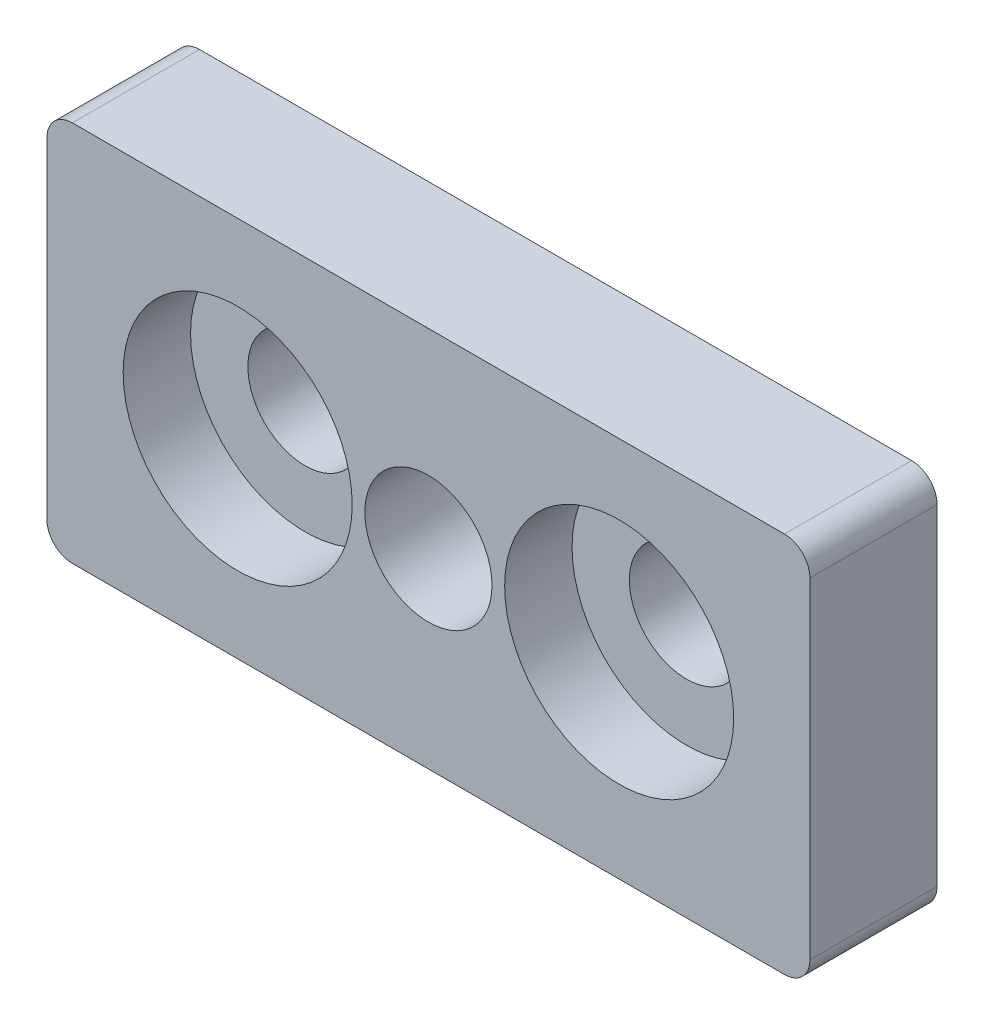
ISO-10303-21;
HEADER;
FILE_DESCRIPTION(('STEP AP214'),'2;1');
FILE_NAME('part.step','',(''),(''),'','','');
FILE_SCHEMA(('AUTOMOTIVE_DESIGN { 1 0 10303 214 1 1 1 1 }'));
ENDSEC;
DATA;
#1=APPLICATION_CONTEXT('core data for automotive mechanical design processes');
#2=APPLICATION_PROTOCOL_DEFINITION('international standard','automotive_design',2000,#1);
#3=PRODUCT_CONTEXT('',#1,'mechanical');
#4=PRODUCT('Part','Part','',(#3));
#5=PRODUCT_RELATED_PRODUCT_CATEGORY('part','',(#4));
#6=PRODUCT_DEFINITION_FORMATION('','',#4);
#7=PRODUCT_DEFINITION_CONTEXT('part definition',#1,'design');
#8=PRODUCT_DEFINITION('design','',#6,#7);
#9=PRODUCT_DEFINITION_SHAPE('','',#8);
#10=(LENGTH_UNIT() NAMED_UNIT(*) SI_UNIT(.MILLI.,.METRE.));
#11=(NAMED_UNIT(*) PLANE_ANGLE_UNIT() SI_UNIT($,.RADIAN.));
#12=(NAMED_UNIT(*) SI_UNIT($,.STERADIAN.) SOLID_ANGLE_UNIT());
#13=UNCERTAINTY_MEASURE_WITH_UNIT(LENGTH_MEASURE(1.E-05),#10,'distance_accuracy_value','');
#14=(GEOMETRIC_REPRESENTATION_CONTEXT(3) GLOBAL_UNCERTAINTY_ASSIGNED_CONTEXT((#13)) GLOBAL_UNIT_ASSIGNED_CONTEXT((#10,
#11,#12)) REPRESENTATION_CONTEXT('',''));
#15=CARTESIAN_POINT('',(0.,0.,0.));
#16=DIRECTION('',(0.,0.,1.));
#17=DIRECTION('',(1.,0.,0.));
#18=AXIS2_PLACEMENT_3D('',#15,#16,#17);
#19=CARTESIAN_POINT('',(30.,-15.,0.));
#20=DIRECTION('',(1.,0.,0.));
#21=DIRECTION('',(0.,1.,0.));
#22=AXIS2_PLACEMENT_3D('',#19,#20,#21);
#23=PLANE('',#22);
#24=DIRECTION('',(0.,1.,0.));
#25=VECTOR('',#24,1.);
#26=CARTESIAN_POINT('',(30.,-15.,10.));
#27=LINE('',#26,#25);
#28=CARTESIAN_POINT('',(30.,-13.,10.));
#29=VERTEX_POINT('',#28);
#30=CARTESIAN_POINT('',(30.,13.,10.));
#31=VERTEX_POINT('',#30);
#32=EDGE_CURVE('E152',#29,#31,#27,.T.);
#33=ORIENTED_EDGE('',*,*,#32,.F.);
#34=DIRECTION('',(0.,0.,1.));
#35=VECTOR('',#34,1.);
#36=CARTESIAN_POINT('',(30.,-13.,0.));
#37=LINE('',#36,#35);
#38=CARTESIAN_POINT('',(30.,-13.,0.));
#39=VERTEX_POINT('',#38);
#40=EDGE_CURVE('E11',#29,#39,#37,.F.);
#41=ORIENTED_EDGE('',*,*,#40,.T.);
#42=DIRECTION('',(0.,1.,0.));
#43=VECTOR('',#42,1.);
#44=CARTESIAN_POINT('',(30.,-15.,0.));
#45=LINE('',#44,#43);
#46=CARTESIAN_POINT('',(30.,13.,0.));
#47=VERTEX_POINT('',#46);
#48=EDGE_CURVE('E155',#39,#47,#45,.T.);
#49=ORIENTED_EDGE('',*,*,#48,.T.);
#50=DIRECTION('',(0.,0.,1.));
#51=VECTOR('',#50,1.);
#52=CARTESIAN_POINT('',(30.,13.,0.));
#53=LINE('',#52,#51);
#54=EDGE_CURVE('E40',#47,#31,#53,.T.);
#55=ORIENTED_EDGE('',*,*,#54,.T.);
#56=EDGE_LOOP('',(#33,#41,#49,#55));
#57=FACE_BOUND('',#56,.T.);
#58=ADVANCED_FACE('F32',(#57),#23,.T.);
#59=CARTESIAN_POINT('',(-30.,-15.,0.));
#60=DIRECTION('',(0.,-1.,0.));
#61=DIRECTION('',(1.,0.,0.));
#62=AXIS2_PLACEMENT_3D('',#59,#60,#61);
#63=PLANE('',#62);
#64=DIRECTION('',(1.,0.,0.));
#65=VECTOR('',#64,1.);
#66=CARTESIAN_POINT('',(-30.,-15.,10.));
#67=LINE('',#66,#65);
#68=CARTESIAN_POINT('',(-28.,-15.,10.));
#69=VERTEX_POINT('',#68);
#70=CARTESIAN_POINT('',(28.,-15.,10.));
#71=VERTEX_POINT('',#70);
#72=EDGE_CURVE('E117',#69,#71,#67,.T.);
#73=ORIENTED_EDGE('',*,*,#72,.F.);
#74=DIRECTION('',(0.,0.,1.));
#75=VECTOR('',#74,1.);
#76=CARTESIAN_POINT('',(-28.,-15.,0.));
#77=LINE('',#76,#75);
#78=CARTESIAN_POINT('',(-28.,-15.,0.));
#79=VERTEX_POINT('',#78);
#80=EDGE_CURVE('E135',#69,#79,#77,.F.);
#81=ORIENTED_EDGE('',*,*,#80,.T.);
#82=DIRECTION('',(1.,0.,0.));
#83=VECTOR('',#82,1.);
#84=CARTESIAN_POINT('',(-30.,-15.,0.));
#85=LINE('',#84,#83);
#86=CARTESIAN_POINT('',(28.,-15.,0.));
#87=VERTEX_POINT('',#86);
#88=EDGE_CURVE('E120',#79,#87,#85,.T.);
#89=ORIENTED_EDGE('',*,*,#88,.T.);
#90=DIRECTION('',(0.,0.,1.));
#91=VECTOR('',#90,1.);
#92=CARTESIAN_POINT('',(28.,-15.,0.));
#93=LINE('',#92,#91);
#94=EDGE_CURVE('E132',#87,#71,#93,.T.);
#95=ORIENTED_EDGE('',*,*,#94,.T.);
#96=EDGE_LOOP('',(#73,#81,#89,#95));
#97=FACE_BOUND('',#96,.T.);
#98=ADVANCED_FACE('F221',(#97),#63,.T.);
#99=CARTESIAN_POINT('',(-30.,15.,0.));
#100=DIRECTION('',(-1.,0.,0.));
#101=DIRECTION('',(0.,-1.,0.));
#102=AXIS2_PLACEMENT_3D('',#99,#100,#101);
#103=PLANE('',#102);
#104=DIRECTION('',(0.,-1.,0.));
#105=VECTOR('',#104,1.);
#106=CARTESIAN_POINT('',(-30.,15.,0.));
#107=LINE('',#106,#105);
#108=CARTESIAN_POINT('',(-30.,13.,0.));
#109=VERTEX_POINT('',#108);
#110=CARTESIAN_POINT('',(-30.,-13.,0.));
#111=VERTEX_POINT('',#110);
#112=EDGE_CURVE('E125',#109,#111,#107,.T.);
#113=ORIENTED_EDGE('',*,*,#112,.T.);
#114=DIRECTION('',(0.,0.,1.));
#115=VECTOR('',#114,1.);
#116=CARTESIAN_POINT('',(-30.,-13.,0.));
#117=LINE('',#116,#115);
#118=CARTESIAN_POINT('',(-30.,-13.,10.));
#119=VERTEX_POINT('',#118);
#120=EDGE_CURVE('E116',#111,#119,#117,.T.);
#121=ORIENTED_EDGE('',*,*,#120,.T.);
#122=DIRECTION('',(0.,-1.,0.));
#123=VECTOR('',#122,1.);
#124=CARTESIAN_POINT('',(-30.,15.,10.));
#125=LINE('',#124,#123);
#126=CARTESIAN_POINT('',(-30.,13.,10.));
#127=VERTEX_POINT('',#126);
#128=EDGE_CURVE('E101',#127,#119,#125,.T.);
#129=ORIENTED_EDGE('',*,*,#128,.F.);
#130=DIRECTION('',(0.,0.,1.));
#131=VECTOR('',#130,1.);
#132=CARTESIAN_POINT('',(-30.,13.,0.));
#133=LINE('',#132,#131);
#134=EDGE_CURVE('E114',#127,#109,#133,.F.);
#135=ORIENTED_EDGE('',*,*,#134,.T.);
#136=EDGE_LOOP('',(#113,#121,#129,#135));
#137=FACE_BOUND('',#136,.T.);
#138=ADVANCED_FACE('F113',(#137),#103,.T.);
#139=CARTESIAN_POINT('',(30.,15.,0.));
#140=DIRECTION('',(0.,1.,0.));
#141=DIRECTION('',(-1.,0.,0.));
#142=AXIS2_PLACEMENT_3D('',#139,#140,#141);
#143=PLANE('',#142);
#144=DIRECTION('',(-1.,0.,0.));
#145=VECTOR('',#144,1.);
#146=CARTESIAN_POINT('',(30.,15.,0.));
#147=LINE('',#146,#145);
#148=CARTESIAN_POINT('',(28.,15.,0.));
#149=VERTEX_POINT('',#148);
#150=CARTESIAN_POINT('',(-28.,15.,0.));
#151=VERTEX_POINT('',#150);
#152=EDGE_CURVE('E167',#149,#151,#147,.T.);
#153=ORIENTED_EDGE('',*,*,#152,.T.);
#154=DIRECTION('',(0.,0.,1.));
#155=VECTOR('',#154,1.);
#156=CARTESIAN_POINT('',(-28.,15.,0.));
#157=LINE('',#156,#155);
#158=CARTESIAN_POINT('',(-28.,15.,10.));
#159=VERTEX_POINT('',#158);
#160=EDGE_CURVE('E145',#151,#159,#157,.T.);
#161=ORIENTED_EDGE('',*,*,#160,.T.);
#162=DIRECTION('',(-1.,0.,0.));
#163=VECTOR('',#162,1.);
#164=CARTESIAN_POINT('',(30.,15.,10.));
#165=LINE('',#164,#163);
#166=CARTESIAN_POINT('',(28.,15.,10.));
#167=VERTEX_POINT('',#166);
#168=EDGE_CURVE('E102',#167,#159,#165,.T.);
#169=ORIENTED_EDGE('',*,*,#168,.F.);
#170=DIRECTION('',(0.,0.,1.));
#171=VECTOR('',#170,1.);
#172=CARTESIAN_POINT('',(28.,15.,0.));
#173=LINE('',#172,#171);
#174=EDGE_CURVE('E54',#167,#149,#173,.F.);
#175=ORIENTED_EDGE('',*,*,#174,.T.);
#176=EDGE_LOOP('',(#153,#161,#169,#175));
#177=FACE_BOUND('',#176,.T.);
#178=ADVANCED_FACE('F230',(#177),#143,.T.);
#179=CARTESIAN_POINT('',(0.,0.,0.));
#180=DIRECTION('',(0.,0.,1.));
#181=DIRECTION('',(1.,0.,0.));
#182=AXIS2_PLACEMENT_3D('',#179,#180,#181);
#183=PLANE('',#182);
#184=CARTESIAN_POINT('',(-15.,0.,0.));
#185=DIRECTION('',(0.,0.,1.));
#186=DIRECTION('',(1.,0.,0.));
#187=AXIS2_PLACEMENT_3D('',#184,#185,#186);
#188=CIRCLE('',#187,4.50000000000001);
#189=CARTESIAN_POINT('',(-10.5,0.,0.));
#190=VERTEX_POINT('',#189);
#191=EDGE_CURVE('E184',#190,#190,#188,.T.);
#192=ORIENTED_EDGE('',*,*,#191,.T.);
#193=EDGE_LOOP('',(#192));
#194=FACE_BOUND('',#193,.T.);
#195=CARTESIAN_POINT('',(15.,0.4628070712156,0.));
#196=DIRECTION('',(0.,0.,1.));
#197=DIRECTION('',(1.,0.,0.));
#198=AXIS2_PLACEMENT_3D('',#195,#196,#197);
#199=CIRCLE('',#198,4.50000000000001);
#200=CARTESIAN_POINT('',(19.5,0.4628070712156,0.));
#201=VERTEX_POINT('',#200);
#202=EDGE_CURVE('E172',#201,#201,#199,.T.);
#203=ORIENTED_EDGE('',*,*,#202,.T.);
#204=EDGE_LOOP('',(#203));
#205=FACE_BOUND('',#204,.T.);
#206=CARTESIAN_POINT('',(0.,0.,0.));
#207=DIRECTION('',(0.,0.,1.));
#208=DIRECTION('',(1.,0.,0.));
#209=AXIS2_PLACEMENT_3D('',#206,#207,#208);
#210=CIRCLE('',#209,4.99999999999999);
#211=CARTESIAN_POINT('',(4.99999999999999,0.,0.));
#212=VERTEX_POINT('',#211);
#213=EDGE_CURVE('E159',#212,#212,#210,.T.);
#214=ORIENTED_EDGE('',*,*,#213,.T.);
#215=EDGE_LOOP('',(#214));
#216=FACE_BOUND('',#215,.T.);
#217=ORIENTED_EDGE('',*,*,#88,.F.);
#218=CARTESIAN_POINT('',(-28.,-13.,0.));
#219=DIRECTION('',(0.,0.,1.));
#220=DIRECTION('',(1.,0.,0.));
#221=AXIS2_PLACEMENT_3D('',#218,#219,#220);
#222=CIRCLE('',#221,2.);
#223=EDGE_CURVE('E142',#79,#111,#222,.F.);
#224=ORIENTED_EDGE('',*,*,#223,.T.);
#225=ORIENTED_EDGE('',*,*,#112,.F.);
#226=CARTESIAN_POINT('',(-28.,13.,0.));
#227=DIRECTION('',(0.,0.,1.));
#228=DIRECTION('',(1.,0.,0.));
#229=AXIS2_PLACEMENT_3D('',#226,#227,#228);
#230=CIRCLE('',#229,2.);
#231=EDGE_CURVE('E47',#109,#151,#230,.F.);
#232=ORIENTED_EDGE('',*,*,#231,.T.);
#233=ORIENTED_EDGE('',*,*,#152,.F.);
#234=CARTESIAN_POINT('',(28.,13.,0.));
#235=DIRECTION('',(0.,0.,1.));
#236=DIRECTION('',(1.,0.,0.));
#237=AXIS2_PLACEMENT_3D('',#234,#235,#236);
#238=CIRCLE('',#237,2.);
#239=EDGE_CURVE('E137',#149,#47,#238,.F.);
#240=ORIENTED_EDGE('',*,*,#239,.T.);
#241=ORIENTED_EDGE('',*,*,#48,.F.);
#242=CARTESIAN_POINT('',(28.,-13.,0.));
#243=DIRECTION('',(0.,0.,1.));
#244=DIRECTION('',(1.,0.,0.));
#245=AXIS2_PLACEMENT_3D('',#242,#243,#244);
#246=CIRCLE('',#245,2.);
#247=EDGE_CURVE('E139',#39,#87,#246,.F.);
#248=ORIENTED_EDGE('',*,*,#247,.T.);
#249=EDGE_LOOP('',(#217,#224,#225,#232,#233,#240,#241,#248));
#250=FACE_BOUND('',#249,.T.);
#251=ADVANCED_FACE('F202',(#194,#205,#216,#250),#183,.F.);
#252=CARTESIAN_POINT('',(0.,0.,10.));
#253=DIRECTION('',(0.,0.,1.));
#254=DIRECTION('',(1.,0.,0.));
#255=AXIS2_PLACEMENT_3D('',#252,#253,#254);
#256=PLANE('',#255);
#257=CARTESIAN_POINT('',(-15.,0.,10.));
#258=DIRECTION('',(0.,0.,1.));
#259=DIRECTION('',(1.,0.,0.));
#260=AXIS2_PLACEMENT_3D('',#257,#258,#259);
#261=CIRCLE('',#260,9.0055);
#262=CARTESIAN_POINT('',(-5.9945,0.,10.));
#263=VERTEX_POINT('',#262);
#264=EDGE_CURVE('E193',#263,#263,#261,.T.);
#265=ORIENTED_EDGE('',*,*,#264,.F.);
#266=EDGE_LOOP('',(#265));
#267=FACE_BOUND('',#266,.T.);
#268=CARTESIAN_POINT('',(15.,0.4628070712156,10.));
#269=DIRECTION('',(0.,0.,1.));
#270=DIRECTION('',(1.,0.,0.));
#271=AXIS2_PLACEMENT_3D('',#268,#269,#270);
#272=CIRCLE('',#271,9.0055);
#273=CARTESIAN_POINT('',(24.0055,0.4628070712156,10.));
#274=VERTEX_POINT('',#273);
#275=EDGE_CURVE('E181',#274,#274,#272,.T.);
#276=ORIENTED_EDGE('',*,*,#275,.F.);
#277=EDGE_LOOP('',(#276));
#278=FACE_BOUND('',#277,.T.);
#279=CARTESIAN_POINT('',(0.,0.,10.));
#280=DIRECTION('',(0.,0.,1.));
#281=DIRECTION('',(1.,0.,0.));
#282=AXIS2_PLACEMENT_3D('',#279,#280,#281);
#283=CIRCLE('',#282,4.99999999999999);
#284=CARTESIAN_POINT('',(4.99999999999999,0.,10.));
#285=VERTEX_POINT('',#284);
#286=EDGE_CURVE('E163',#285,#285,#283,.T.);
#287=ORIENTED_EDGE('',*,*,#286,.F.);
#288=EDGE_LOOP('',(#287));
#289=FACE_BOUND('',#288,.T.);
#290=ORIENTED_EDGE('',*,*,#128,.T.);
#291=CARTESIAN_POINT('',(-28.,-13.,10.));
#292=DIRECTION('',(0.,0.,1.));
#293=DIRECTION('',(1.,0.,0.));
#294=AXIS2_PLACEMENT_3D('',#291,#292,#293);
#295=CIRCLE('',#294,2.);
#296=EDGE_CURVE('E107',#119,#69,#295,.T.);
#297=ORIENTED_EDGE('',*,*,#296,.T.);
#298=ORIENTED_EDGE('',*,*,#72,.T.);
#299=CARTESIAN_POINT('',(28.,-13.,10.));
#300=DIRECTION('',(0.,0.,1.));
#301=DIRECTION('',(1.,0.,0.));
#302=AXIS2_PLACEMENT_3D('',#299,#300,#301);
#303=CIRCLE('',#302,2.);
#304=EDGE_CURVE('E108',#71,#29,#303,.T.);
#305=ORIENTED_EDGE('',*,*,#304,.T.);
#306=ORIENTED_EDGE('',*,*,#32,.T.);
#307=CARTESIAN_POINT('',(28.,13.,10.));
#308=DIRECTION('',(0.,0.,1.));
#309=DIRECTION('',(1.,0.,0.));
#310=AXIS2_PLACEMENT_3D('',#307,#308,#309);
#311=CIRCLE('',#310,2.);
#312=EDGE_CURVE('E122',#31,#167,#311,.T.);
#313=ORIENTED_EDGE('',*,*,#312,.T.);
#314=ORIENTED_EDGE('',*,*,#168,.T.);
#315=CARTESIAN_POINT('',(-28.,13.,10.));
#316=DIRECTION('',(0.,0.,1.));
#317=DIRECTION('',(1.,0.,0.));
#318=AXIS2_PLACEMENT_3D('',#315,#316,#317);
#319=CIRCLE('',#318,2.);
#320=EDGE_CURVE('E98',#159,#127,#319,.T.);
#321=ORIENTED_EDGE('',*,*,#320,.T.);
#322=EDGE_LOOP('',(#290,#297,#298,#305,#306,#313,#314,#321));
#323=FACE_BOUND('',#322,.T.);
#324=ADVANCED_FACE('F100',(#267,#278,#289,#323),#256,.T.);
#325=CARTESIAN_POINT('',(0.,0.,10.));
#326=DIRECTION('',(0.,0.,1.));
#327=DIRECTION('',(1.,0.,0.));
#328=AXIS2_PLACEMENT_3D('',#325,#326,#327);
#329=CYLINDRICAL_SURFACE('',#328,4.99999999999999);
#330=ORIENTED_EDGE('',*,*,#213,.F.);
#331=EDGE_LOOP('',(#330));
#332=FACE_BOUND('',#331,.T.);
#333=ORIENTED_EDGE('',*,*,#286,.T.);
#334=EDGE_LOOP('',(#333));
#335=FACE_BOUND('',#334,.T.);
#336=ADVANCED_FACE('F201',(#332,#335),#329,.F.);
#337=CARTESIAN_POINT('',(15.,0.4628070712156,10.));
#338=DIRECTION('',(0.,0.,1.));
#339=DIRECTION('',(1.,0.,0.));
#340=AXIS2_PLACEMENT_3D('',#337,#338,#339);
#341=CYLINDRICAL_SURFACE('',#340,4.50000000000001);
#342=ORIENTED_EDGE('',*,*,#202,.F.);
#343=EDGE_LOOP('',(#342));
#344=FACE_BOUND('',#343,.T.);
#345=CARTESIAN_POINT('',(15.,0.4628070712156,4.7));
#346=DIRECTION('',(0.,0.,1.));
#347=DIRECTION('',(1.,0.,0.));
#348=AXIS2_PLACEMENT_3D('',#345,#346,#347);
#349=CIRCLE('',#348,4.50000000000001);
#350=CARTESIAN_POINT('',(19.5,0.4628070712156,4.7));
#351=VERTEX_POINT('',#350);
#352=EDGE_CURVE('E175',#351,#351,#349,.T.);
#353=ORIENTED_EDGE('',*,*,#352,.T.);
#354=EDGE_LOOP('',(#353));
#355=FACE_BOUND('',#354,.T.);
#356=ADVANCED_FACE('F209',(#344,#355),#341,.F.);
#357=CARTESIAN_POINT('',(19.5,0.4628070712156,4.7));
#358=DIRECTION('',(0.,0.,-1.));
#359=DIRECTION('',(-1.,0.,0.));
#360=AXIS2_PLACEMENT_3D('',#357,#358,#359);
#361=PLANE('',#360);
#362=ORIENTED_EDGE('',*,*,#352,.F.);
#363=EDGE_LOOP('',(#362));
#364=FACE_BOUND('',#363,.T.);
#365=CARTESIAN_POINT('',(15.,0.4628070712156,4.7));
#366=DIRECTION('',(0.,0.,1.));
#367=DIRECTION('',(1.,0.,0.));
#368=AXIS2_PLACEMENT_3D('',#365,#366,#367);
#369=CIRCLE('',#368,9.0055);
#370=CARTESIAN_POINT('',(24.0055,0.4628070712156,4.7));
#371=VERTEX_POINT('',#370);
#372=EDGE_CURVE('E178',#371,#371,#369,.T.);
#373=ORIENTED_EDGE('',*,*,#372,.T.);
#374=EDGE_LOOP('',(#373));
#375=FACE_BOUND('',#374,.T.);
#376=ADVANCED_FACE('F215',(#364,#375),#361,.F.);
#377=CARTESIAN_POINT('',(15.,0.4628070712156,10.));
#378=DIRECTION('',(0.,0.,1.));
#379=DIRECTION('',(1.,0.,0.));
#380=AXIS2_PLACEMENT_3D('',#377,#378,#379);
#381=CYLINDRICAL_SURFACE('',#380,9.0055);
#382=ORIENTED_EDGE('',*,*,#372,.F.);
#383=EDGE_LOOP('',(#382));
#384=FACE_BOUND('',#383,.T.);
#385=ORIENTED_EDGE('',*,*,#275,.T.);
#386=EDGE_LOOP('',(#385));
#387=FACE_BOUND('',#386,.T.);
#388=ADVANCED_FACE('F295',(#384,#387),#381,.F.);
#389=CARTESIAN_POINT('',(-15.,0.,10.));
#390=DIRECTION('',(0.,0.,1.));
#391=DIRECTION('',(1.,0.,0.));
#392=AXIS2_PLACEMENT_3D('',#389,#390,#391);
#393=CYLINDRICAL_SURFACE('',#392,4.50000000000001);
#394=ORIENTED_EDGE('',*,*,#191,.F.);
#395=EDGE_LOOP('',(#394));
#396=FACE_BOUND('',#395,.T.);
#397=CARTESIAN_POINT('',(-15.,0.,4.7));
#398=DIRECTION('',(0.,0.,1.));
#399=DIRECTION('',(1.,0.,0.));
#400=AXIS2_PLACEMENT_3D('',#397,#398,#399);
#401=CIRCLE('',#400,4.50000000000001);
#402=CARTESIAN_POINT('',(-10.5,0.,4.7));
#403=VERTEX_POINT('',#402);
#404=EDGE_CURVE('E187',#403,#403,#401,.T.);
#405=ORIENTED_EDGE('',*,*,#404,.T.);
#406=EDGE_LOOP('',(#405));
#407=FACE_BOUND('',#406,.T.);
#408=ADVANCED_FACE('F285',(#396,#407),#393,.F.);
#409=CARTESIAN_POINT('',(-10.5,0.,4.7));
#410=DIRECTION('',(0.,0.,-1.));
#411=DIRECTION('',(-1.,0.,0.));
#412=AXIS2_PLACEMENT_3D('',#409,#410,#411);
#413=PLANE('',#412);
#414=ORIENTED_EDGE('',*,*,#404,.F.);
#415=EDGE_LOOP('',(#414));
#416=FACE_BOUND('',#415,.T.);
#417=CARTESIAN_POINT('',(-15.,0.,4.7));
#418=DIRECTION('',(0.,0.,1.));
#419=DIRECTION('',(1.,0.,0.));
#420=AXIS2_PLACEMENT_3D('',#417,#418,#419);
#421=CIRCLE('',#420,9.0055);
#422=CARTESIAN_POINT('',(-5.9945,0.,4.7));
#423=VERTEX_POINT('',#422);
#424=EDGE_CURVE('E190',#423,#423,#421,.T.);
#425=ORIENTED_EDGE('',*,*,#424,.T.);
#426=EDGE_LOOP('',(#425));
#427=FACE_BOUND('',#426,.T.);
#428=ADVANCED_FACE('F274',(#416,#427),#413,.F.);
#429=CARTESIAN_POINT('',(-15.,0.,10.));
#430=DIRECTION('',(0.,0.,1.));
#431=DIRECTION('',(1.,0.,0.));
#432=AXIS2_PLACEMENT_3D('',#429,#430,#431);
#433=CYLINDRICAL_SURFACE('',#432,9.0055);
#434=ORIENTED_EDGE('',*,*,#424,.F.);
#435=EDGE_LOOP('',(#434));
#436=FACE_BOUND('',#435,.T.);
#437=ORIENTED_EDGE('',*,*,#264,.T.);
#438=EDGE_LOOP('',(#437));
#439=FACE_BOUND('',#438,.T.);
#440=ADVANCED_FACE('F197',(#436,#439),#433,.F.);
#441=CARTESIAN_POINT('',(-28.,-13.,0.));
#442=DIRECTION('',(0.,0.,1.));
#443=DIRECTION('',(1.,0.,0.));
#444=AXIS2_PLACEMENT_3D('',#441,#442,#443);
#445=CYLINDRICAL_SURFACE('',#444,2.);
#446=ORIENTED_EDGE('',*,*,#223,.F.);
#447=ORIENTED_EDGE('',*,*,#80,.F.);
#448=ORIENTED_EDGE('',*,*,#296,.F.);
#449=ORIENTED_EDGE('',*,*,#120,.F.);
#450=EDGE_LOOP('',(#446,#447,#448,#449));
#451=FACE_BOUND('',#450,.T.);
#452=ADVANCED_FACE('F232',(#451),#445,.T.);
#453=CARTESIAN_POINT('',(-28.,13.,0.));
#454=DIRECTION('',(0.,0.,1.));
#455=DIRECTION('',(1.,0.,0.));
#456=AXIS2_PLACEMENT_3D('',#453,#454,#455);
#457=CYLINDRICAL_SURFACE('',#456,2.);
#458=ORIENTED_EDGE('',*,*,#231,.F.);
#459=ORIENTED_EDGE('',*,*,#134,.F.);
#460=ORIENTED_EDGE('',*,*,#320,.F.);
#461=ORIENTED_EDGE('',*,*,#160,.F.);
#462=EDGE_LOOP('',(#458,#459,#460,#461));
#463=FACE_BOUND('',#462,.T.);
#464=ADVANCED_FACE('F119',(#463),#457,.T.);
#465=CARTESIAN_POINT('',(28.,-13.,0.));
#466=DIRECTION('',(0.,0.,1.));
#467=DIRECTION('',(1.,0.,0.));
#468=AXIS2_PLACEMENT_3D('',#465,#466,#467);
#469=CYLINDRICAL_SURFACE('',#468,2.);
#470=ORIENTED_EDGE('',*,*,#247,.F.);
#471=ORIENTED_EDGE('',*,*,#40,.F.);
#472=ORIENTED_EDGE('',*,*,#304,.F.);
#473=ORIENTED_EDGE('',*,*,#94,.F.);
#474=EDGE_LOOP('',(#470,#471,#472,#473));
#475=FACE_BOUND('',#474,.T.);
#476=ADVANCED_FACE('F237',(#475),#469,.T.);
#477=CARTESIAN_POINT('',(28.,13.,0.));
#478=DIRECTION('',(0.,0.,1.));
#479=DIRECTION('',(1.,0.,0.));
#480=AXIS2_PLACEMENT_3D('',#477,#478,#479);
#481=CYLINDRICAL_SURFACE('',#480,2.);
#482=ORIENTED_EDGE('',*,*,#239,.F.);
#483=ORIENTED_EDGE('',*,*,#174,.F.);
#484=ORIENTED_EDGE('',*,*,#312,.F.);
#485=ORIENTED_EDGE('',*,*,#54,.F.);
#486=EDGE_LOOP('',(#482,#483,#484,#485));
#487=FACE_BOUND('',#486,.T.);
#488=ADVANCED_FACE('F34',(#487),#481,.T.);
#489=CLOSED_SHELL('',(#58,#98,#138,#178,#251,#324,#336,#356,#376,#388,#408,#428,#440,#452,#464,
#476,#488));
#490=MANIFOLD_SOLID_BREP('B2',#489);
#491=ADVANCED_BREP_SHAPE_REPRESENTATION('',(#18,#490),#14);
#492=SHAPE_DEFINITION_REPRESENTATION(#9,#491);
ENDSEC;
END-ISO-10303-21;
